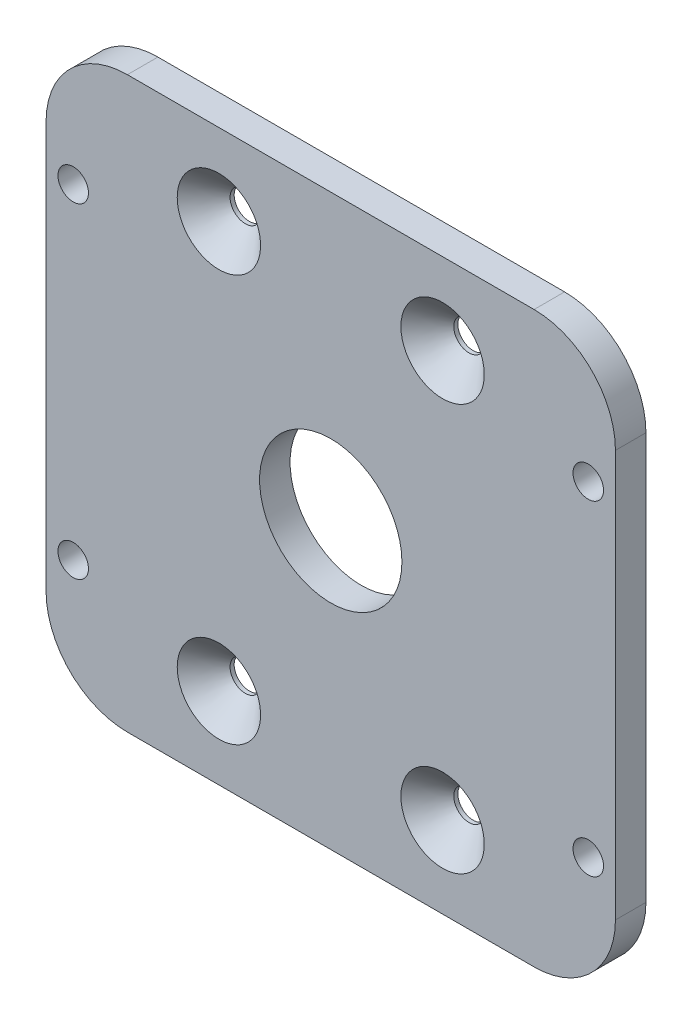
ISO-10303-21;
HEADER;
FILE_DESCRIPTION(('STEP AP214'),'2;1');
FILE_NAME('part.step','',(''),(''),'','','');
FILE_SCHEMA(('AUTOMOTIVE_DESIGN { 1 0 10303 214 1 1 1 1 }'));
ENDSEC;
DATA;
#1=APPLICATION_CONTEXT('core data for automotive mechanical design processes');
#2=APPLICATION_PROTOCOL_DEFINITION('international standard','automotive_design',2000,#1);
#3=PRODUCT_CONTEXT('',#1,'mechanical');
#4=PRODUCT('Part','Part','',(#3));
#5=PRODUCT_RELATED_PRODUCT_CATEGORY('part','',(#4));
#6=PRODUCT_DEFINITION_FORMATION('','',#4);
#7=PRODUCT_DEFINITION_CONTEXT('part definition',#1,'design');
#8=PRODUCT_DEFINITION('design','',#6,#7);
#9=PRODUCT_DEFINITION_SHAPE('','',#8);
#10=(LENGTH_UNIT() NAMED_UNIT(*) SI_UNIT(.MILLI.,.METRE.));
#11=(NAMED_UNIT(*) PLANE_ANGLE_UNIT() SI_UNIT($,.RADIAN.));
#12=(NAMED_UNIT(*) SI_UNIT($,.STERADIAN.) SOLID_ANGLE_UNIT());
#13=UNCERTAINTY_MEASURE_WITH_UNIT(LENGTH_MEASURE(1.E-05),#10,'distance_accuracy_value','');
#14=(GEOMETRIC_REPRESENTATION_CONTEXT(3) GLOBAL_UNCERTAINTY_ASSIGNED_CONTEXT((#13)) GLOBAL_UNIT_ASSIGNED_CONTEXT((#10,
#11,#12)) REPRESENTATION_CONTEXT('',''));
#15=CARTESIAN_POINT('',(0.,0.,0.));
#16=DIRECTION('',(0.,0.,1.));
#17=DIRECTION('',(1.,0.,0.));
#18=AXIS2_PLACEMENT_3D('',#15,#16,#17);
#19=CARTESIAN_POINT('',(48.,48.,3.));
#20=DIRECTION('',(0.,0.,-1.));
#21=DIRECTION('',(-1.,0.,0.));
#22=AXIS2_PLACEMENT_3D('',#19,#20,#21);
#23=CYLINDRICAL_SURFACE('',#22,7.99999999999999);
#24=CARTESIAN_POINT('',(48.,48.,0.));
#25=DIRECTION('',(0.,0.,1.));
#26=DIRECTION('',(-1.,0.,0.));
#27=AXIS2_PLACEMENT_3D('',#24,#25,#26);
#28=CIRCLE('',#27,7.99999999999999);
#29=CARTESIAN_POINT('',(56.,48.,0.));
#30=VERTEX_POINT('',#29);
#31=CARTESIAN_POINT('',(48.,56.,0.));
#32=VERTEX_POINT('',#31);
#33=EDGE_CURVE('E137',#30,#32,#28,.T.);
#34=ORIENTED_EDGE('',*,*,#33,.T.);
#35=DIRECTION('',(0.,0.,-1.));
#36=VECTOR('',#35,1.);
#37=CARTESIAN_POINT('',(48.,56.,3.));
#38=LINE('',#37,#36);
#39=CARTESIAN_POINT('',(48.,56.,3.));
#40=VERTEX_POINT('',#39);
#41=EDGE_CURVE('E165',#40,#32,#38,.T.);
#42=ORIENTED_EDGE('',*,*,#41,.F.);
#43=CARTESIAN_POINT('',(48.,48.,3.));
#44=DIRECTION('',(0.,0.,1.));
#45=DIRECTION('',(-1.,0.,0.));
#46=AXIS2_PLACEMENT_3D('',#43,#44,#45);
#47=CIRCLE('',#46,7.99999999999999);
#48=CARTESIAN_POINT('',(56.,48.,3.));
#49=VERTEX_POINT('',#48);
#50=EDGE_CURVE('E152',#49,#40,#47,.T.);
#51=ORIENTED_EDGE('',*,*,#50,.F.);
#52=DIRECTION('',(0.,0.,-1.));
#53=VECTOR('',#52,1.);
#54=CARTESIAN_POINT('',(56.,48.,3.));
#55=LINE('',#54,#53);
#56=EDGE_CURVE('E133',#49,#30,#55,.T.);
#57=ORIENTED_EDGE('',*,*,#56,.T.);
#58=EDGE_LOOP('',(#34,#42,#51,#57));
#59=FACE_BOUND('',#58,.T.);
#60=ADVANCED_FACE('F38',(#59),#23,.T.);
#61=CARTESIAN_POINT('',(8.,56.,3.));
#62=DIRECTION('',(0.,-1.,0.));
#63=DIRECTION('',(1.,0.,0.));
#64=AXIS2_PLACEMENT_3D('',#61,#62,#63);
#65=PLANE('',#64);
#66=DIRECTION('',(-1.,0.,0.));
#67=VECTOR('',#66,1.);
#68=CARTESIAN_POINT('',(8.,56.,0.));
#69=LINE('',#68,#67);
#70=CARTESIAN_POINT('',(8.,56.,0.));
#71=VERTEX_POINT('',#70);
#72=EDGE_CURVE('E140',#32,#71,#69,.T.);
#73=ORIENTED_EDGE('',*,*,#72,.T.);
#74=DIRECTION('',(0.,0.,-1.));
#75=VECTOR('',#74,1.);
#76=CARTESIAN_POINT('',(8.,56.,3.));
#77=LINE('',#76,#75);
#78=CARTESIAN_POINT('',(8.,56.,3.));
#79=VERTEX_POINT('',#78);
#80=EDGE_CURVE('E162',#79,#71,#77,.T.);
#81=ORIENTED_EDGE('',*,*,#80,.F.);
#82=DIRECTION('',(-1.,0.,0.));
#83=VECTOR('',#82,1.);
#84=CARTESIAN_POINT('',(8.,56.,3.));
#85=LINE('',#84,#83);
#86=EDGE_CURVE('E100',#40,#79,#85,.T.);
#87=ORIENTED_EDGE('',*,*,#86,.F.);
#88=ORIENTED_EDGE('',*,*,#41,.T.);
#89=EDGE_LOOP('',(#73,#81,#87,#88));
#90=FACE_BOUND('',#89,.T.);
#91=ADVANCED_FACE('F205',(#90),#65,.F.);
#92=CARTESIAN_POINT('',(8.,48.,3.));
#93=DIRECTION('',(0.,0.,-1.));
#94=DIRECTION('',(-1.,0.,0.));
#95=AXIS2_PLACEMENT_3D('',#92,#93,#94);
#96=CYLINDRICAL_SURFACE('',#95,8.);
#97=CARTESIAN_POINT('',(8.,48.,0.));
#98=DIRECTION('',(0.,0.,1.));
#99=DIRECTION('',(-1.,0.,0.));
#100=AXIS2_PLACEMENT_3D('',#97,#98,#99);
#101=CIRCLE('',#100,8.);
#102=CARTESIAN_POINT('',(0.,48.,0.));
#103=VERTEX_POINT('',#102);
#104=EDGE_CURVE('E143',#71,#103,#101,.T.);
#105=ORIENTED_EDGE('',*,*,#104,.T.);
#106=DIRECTION('',(0.,0.,-1.));
#107=VECTOR('',#106,1.);
#108=CARTESIAN_POINT('',(0.,48.,3.));
#109=LINE('',#108,#107);
#110=CARTESIAN_POINT('',(0.,48.,3.));
#111=VERTEX_POINT('',#110);
#112=EDGE_CURVE('E159',#111,#103,#109,.T.);
#113=ORIENTED_EDGE('',*,*,#112,.F.);
#114=CARTESIAN_POINT('',(8.,48.,3.));
#115=DIRECTION('',(0.,0.,1.));
#116=DIRECTION('',(-1.,0.,0.));
#117=AXIS2_PLACEMENT_3D('',#114,#115,#116);
#118=CIRCLE('',#117,8.);
#119=EDGE_CURVE('E288',#79,#111,#118,.T.);
#120=ORIENTED_EDGE('',*,*,#119,.F.);
#121=ORIENTED_EDGE('',*,*,#80,.T.);
#122=EDGE_LOOP('',(#105,#113,#120,#121));
#123=FACE_BOUND('',#122,.T.);
#124=ADVANCED_FACE('F211',(#123),#96,.T.);
#125=CARTESIAN_POINT('',(0.,8.,3.));
#126=DIRECTION('',(1.,0.,0.));
#127=DIRECTION('',(0.,1.,0.));
#128=AXIS2_PLACEMENT_3D('',#125,#126,#127);
#129=PLANE('',#128);
#130=DIRECTION('',(0.,-1.,0.));
#131=VECTOR('',#130,1.);
#132=CARTESIAN_POINT('',(0.,8.,0.));
#133=LINE('',#132,#131);
#134=CARTESIAN_POINT('',(0.,8.,0.));
#135=VERTEX_POINT('',#134);
#136=EDGE_CURVE('E145',#103,#135,#133,.T.);
#137=ORIENTED_EDGE('',*,*,#136,.T.);
#138=DIRECTION('',(0.,0.,-1.));
#139=VECTOR('',#138,1.);
#140=CARTESIAN_POINT('',(0.,8.,3.));
#141=LINE('',#140,#139);
#142=CARTESIAN_POINT('',(0.,8.,3.));
#143=VERTEX_POINT('',#142);
#144=EDGE_CURVE('E156',#143,#135,#141,.T.);
#145=ORIENTED_EDGE('',*,*,#144,.F.);
#146=DIRECTION('',(0.,-1.,0.));
#147=VECTOR('',#146,1.);
#148=CARTESIAN_POINT('',(0.,8.,3.));
#149=LINE('',#148,#147);
#150=EDGE_CURVE('E290',#111,#143,#149,.T.);
#151=ORIENTED_EDGE('',*,*,#150,.F.);
#152=ORIENTED_EDGE('',*,*,#112,.T.);
#153=EDGE_LOOP('',(#137,#145,#151,#152));
#154=FACE_BOUND('',#153,.T.);
#155=ADVANCED_FACE('F296',(#154),#129,.F.);
#156=CARTESIAN_POINT('',(8.,8.,3.));
#157=DIRECTION('',(0.,0.,-1.));
#158=DIRECTION('',(-1.,0.,0.));
#159=AXIS2_PLACEMENT_3D('',#156,#157,#158);
#160=CYLINDRICAL_SURFACE('',#159,8.);
#161=CARTESIAN_POINT('',(8.,8.,0.));
#162=DIRECTION('',(0.,0.,1.));
#163=DIRECTION('',(-1.,0.,0.));
#164=AXIS2_PLACEMENT_3D('',#161,#162,#163);
#165=CIRCLE('',#164,8.);
#166=CARTESIAN_POINT('',(8.,0.,0.));
#167=VERTEX_POINT('',#166);
#168=EDGE_CURVE('E147',#135,#167,#165,.T.);
#169=ORIENTED_EDGE('',*,*,#168,.T.);
#170=DIRECTION('',(0.,0.,-1.));
#171=VECTOR('',#170,1.);
#172=CARTESIAN_POINT('',(8.,0.,3.));
#173=LINE('',#172,#171);
#174=CARTESIAN_POINT('',(8.,0.,3.));
#175=VERTEX_POINT('',#174);
#176=EDGE_CURVE('E128',#175,#167,#173,.T.);
#177=ORIENTED_EDGE('',*,*,#176,.F.);
#178=CARTESIAN_POINT('',(8.,8.,3.));
#179=DIRECTION('',(0.,0.,1.));
#180=DIRECTION('',(-1.,0.,0.));
#181=AXIS2_PLACEMENT_3D('',#178,#179,#180);
#182=CIRCLE('',#181,8.);
#183=EDGE_CURVE('E119',#143,#175,#182,.T.);
#184=ORIENTED_EDGE('',*,*,#183,.F.);
#185=ORIENTED_EDGE('',*,*,#144,.T.);
#186=EDGE_LOOP('',(#169,#177,#184,#185));
#187=FACE_BOUND('',#186,.T.);
#188=ADVANCED_FACE('F300',(#187),#160,.T.);
#189=CARTESIAN_POINT('',(8.,0.,3.));
#190=DIRECTION('',(0.,1.,0.));
#191=DIRECTION('',(0.,0.,1.));
#192=AXIS2_PLACEMENT_3D('',#189,#190,#191);
#193=PLANE('',#192);
#194=DIRECTION('',(1.,0.,0.));
#195=VECTOR('',#194,1.);
#196=CARTESIAN_POINT('',(8.,0.,0.));
#197=LINE('',#196,#195);
#198=CARTESIAN_POINT('',(48.,0.,0.));
#199=VERTEX_POINT('',#198);
#200=EDGE_CURVE('E127',#167,#199,#197,.T.);
#201=ORIENTED_EDGE('',*,*,#200,.T.);
#202=DIRECTION('',(0.,0.,-1.));
#203=VECTOR('',#202,1.);
#204=CARTESIAN_POINT('',(48.,0.,3.));
#205=LINE('',#204,#203);
#206=CARTESIAN_POINT('',(48.,0.,3.));
#207=VERTEX_POINT('',#206);
#208=EDGE_CURVE('E124',#207,#199,#205,.T.);
#209=ORIENTED_EDGE('',*,*,#208,.F.);
#210=DIRECTION('',(1.,0.,0.));
#211=VECTOR('',#210,1.);
#212=CARTESIAN_POINT('',(8.,0.,3.));
#213=LINE('',#212,#211);
#214=EDGE_CURVE('E113',#175,#207,#213,.T.);
#215=ORIENTED_EDGE('',*,*,#214,.F.);
#216=ORIENTED_EDGE('',*,*,#176,.T.);
#217=EDGE_LOOP('',(#201,#209,#215,#216));
#218=FACE_BOUND('',#217,.T.);
#219=ADVANCED_FACE('F125',(#218),#193,.F.);
#220=CARTESIAN_POINT('',(48.,8.,3.));
#221=DIRECTION('',(0.,0.,-1.));
#222=DIRECTION('',(-1.,0.,0.));
#223=AXIS2_PLACEMENT_3D('',#220,#221,#222);
#224=CYLINDRICAL_SURFACE('',#223,8.);
#225=CARTESIAN_POINT('',(48.,8.,0.));
#226=DIRECTION('',(0.,0.,1.));
#227=DIRECTION('',(1.,0.,0.));
#228=AXIS2_PLACEMENT_3D('',#225,#226,#227);
#229=CIRCLE('',#228,8.);
#230=CARTESIAN_POINT('',(56.,8.,0.));
#231=VERTEX_POINT('',#230);
#232=EDGE_CURVE('E85',#199,#231,#229,.T.);
#233=ORIENTED_EDGE('',*,*,#232,.T.);
#234=DIRECTION('',(0.,0.,-1.));
#235=VECTOR('',#234,1.);
#236=CARTESIAN_POINT('',(56.,8.,3.));
#237=LINE('',#236,#235);
#238=CARTESIAN_POINT('',(56.,8.,3.));
#239=VERTEX_POINT('',#238);
#240=EDGE_CURVE('E129',#239,#231,#237,.T.);
#241=ORIENTED_EDGE('',*,*,#240,.F.);
#242=CARTESIAN_POINT('',(48.,8.,3.));
#243=DIRECTION('',(0.,0.,1.));
#244=DIRECTION('',(1.,0.,0.));
#245=AXIS2_PLACEMENT_3D('',#242,#243,#244);
#246=CIRCLE('',#245,8.);
#247=EDGE_CURVE('E117',#207,#239,#246,.T.);
#248=ORIENTED_EDGE('',*,*,#247,.F.);
#249=ORIENTED_EDGE('',*,*,#208,.T.);
#250=EDGE_LOOP('',(#233,#241,#248,#249));
#251=FACE_BOUND('',#250,.T.);
#252=ADVANCED_FACE('F131',(#251),#224,.T.);
#253=CARTESIAN_POINT('',(56.,8.,3.));
#254=DIRECTION('',(-1.,0.,0.));
#255=DIRECTION('',(0.,-1.,0.));
#256=AXIS2_PLACEMENT_3D('',#253,#254,#255);
#257=PLANE('',#256);
#258=DIRECTION('',(0.,1.,0.));
#259=VECTOR('',#258,1.);
#260=CARTESIAN_POINT('',(56.,8.,0.));
#261=LINE('',#260,#259);
#262=EDGE_CURVE('E91',#231,#30,#261,.T.);
#263=ORIENTED_EDGE('',*,*,#262,.T.);
#264=ORIENTED_EDGE('',*,*,#56,.F.);
#265=DIRECTION('',(0.,1.,0.));
#266=VECTOR('',#265,1.);
#267=CARTESIAN_POINT('',(56.,8.,3.));
#268=LINE('',#267,#266);
#269=EDGE_CURVE('E56',#239,#49,#268,.T.);
#270=ORIENTED_EDGE('',*,*,#269,.F.);
#271=ORIENTED_EDGE('',*,*,#240,.T.);
#272=EDGE_LOOP('',(#263,#264,#270,#271));
#273=FACE_BOUND('',#272,.T.);
#274=ADVANCED_FACE('F307',(#273),#257,.F.);
#275=CARTESIAN_POINT('',(48.,48.,3.));
#276=DIRECTION('',(0.,0.,-1.));
#277=DIRECTION('',(-1.,0.,0.));
#278=AXIS2_PLACEMENT_3D('',#275,#276,#277);
#279=PLANE('',#278);
#280=CARTESIAN_POINT('',(39.,8.,3.));
#281=DIRECTION('',(0.,0.,-1.));
#282=DIRECTION('',(-1.,0.,0.));
#283=AXIS2_PLACEMENT_3D('',#280,#281,#282);
#284=CIRCLE('',#283,4.1);
#285=CARTESIAN_POINT('',(34.9,8.,3.));
#286=VERTEX_POINT('',#285);
#287=EDGE_CURVE('E179',#286,#286,#284,.T.);
#288=ORIENTED_EDGE('',*,*,#287,.T.);
#289=EDGE_LOOP('',(#288));
#290=FACE_BOUND('',#289,.T.);
#291=CARTESIAN_POINT('',(17.,8.,3.));
#292=DIRECTION('',(0.,0.,-1.));
#293=DIRECTION('',(-1.,0.,0.));
#294=AXIS2_PLACEMENT_3D('',#291,#292,#293);
#295=CIRCLE('',#294,4.10000000000002);
#296=CARTESIAN_POINT('',(12.9,8.,3.));
#297=VERTEX_POINT('',#296);
#298=EDGE_CURVE('E176',#297,#297,#295,.T.);
#299=ORIENTED_EDGE('',*,*,#298,.T.);
#300=EDGE_LOOP('',(#299));
#301=FACE_BOUND('',#300,.T.);
#302=CARTESIAN_POINT('',(38.9999999999999,48.,3.));
#303=DIRECTION('',(0.,0.,-1.));
#304=DIRECTION('',(-1.,0.,0.));
#305=AXIS2_PLACEMENT_3D('',#302,#303,#304);
#306=CIRCLE('',#305,4.10000000000001);
#307=CARTESIAN_POINT('',(34.8999999999999,48.,3.));
#308=VERTEX_POINT('',#307);
#309=EDGE_CURVE('E173',#308,#308,#306,.T.);
#310=ORIENTED_EDGE('',*,*,#309,.T.);
#311=EDGE_LOOP('',(#310));
#312=FACE_BOUND('',#311,.T.);
#313=CARTESIAN_POINT('',(16.9999999999999,48.,3.));
#314=DIRECTION('',(0.,0.,-1.));
#315=DIRECTION('',(-1.,0.,0.));
#316=AXIS2_PLACEMENT_3D('',#313,#314,#315);
#317=CIRCLE('',#316,4.10000000000002);
#318=CARTESIAN_POINT('',(12.8999999999998,48.,3.));
#319=VERTEX_POINT('',#318);
#320=EDGE_CURVE('E170',#319,#319,#317,.T.);
#321=ORIENTED_EDGE('',*,*,#320,.T.);
#322=EDGE_LOOP('',(#321));
#323=FACE_BOUND('',#322,.T.);
#324=CARTESIAN_POINT('',(2.6699999999999,44.,3.));
#325=DIRECTION('',(0.,0.,1.));
#326=DIRECTION('',(1.,0.,0.));
#327=AXIS2_PLACEMENT_3D('',#324,#325,#326);
#328=CIRCLE('',#327,1.5);
#329=CARTESIAN_POINT('',(4.1699999999999,44.,3.));
#330=VERTEX_POINT('',#329);
#331=EDGE_CURVE('E250',#330,#330,#328,.T.);
#332=ORIENTED_EDGE('',*,*,#331,.F.);
#333=EDGE_LOOP('',(#332));
#334=FACE_BOUND('',#333,.T.);
#335=CARTESIAN_POINT('',(53.3299999999999,44.,3.));
#336=DIRECTION('',(0.,0.,1.));
#337=DIRECTION('',(1.,0.,0.));
#338=AXIS2_PLACEMENT_3D('',#335,#336,#337);
#339=CIRCLE('',#338,1.5);
#340=CARTESIAN_POINT('',(54.8299999999999,44.,3.));
#341=VERTEX_POINT('',#340);
#342=EDGE_CURVE('E268',#341,#341,#339,.T.);
#343=ORIENTED_EDGE('',*,*,#342,.F.);
#344=EDGE_LOOP('',(#343));
#345=FACE_BOUND('',#344,.T.);
#346=CARTESIAN_POINT('',(53.33,12.,3.));
#347=DIRECTION('',(0.,0.,1.));
#348=DIRECTION('',(1.,0.,0.));
#349=AXIS2_PLACEMENT_3D('',#346,#347,#348);
#350=CIRCLE('',#349,1.5);
#351=CARTESIAN_POINT('',(54.83,12.,3.));
#352=VERTEX_POINT('',#351);
#353=EDGE_CURVE('E262',#352,#352,#350,.T.);
#354=ORIENTED_EDGE('',*,*,#353,.F.);
#355=EDGE_LOOP('',(#354));
#356=FACE_BOUND('',#355,.T.);
#357=CARTESIAN_POINT('',(2.67000000000001,12.,3.));
#358=DIRECTION('',(0.,0.,1.));
#359=DIRECTION('',(1.,0.,0.));
#360=AXIS2_PLACEMENT_3D('',#357,#358,#359);
#361=CIRCLE('',#360,1.5);
#362=CARTESIAN_POINT('',(4.17000000000001,12.,3.));
#363=VERTEX_POINT('',#362);
#364=EDGE_CURVE('E261',#363,#363,#361,.T.);
#365=ORIENTED_EDGE('',*,*,#364,.F.);
#366=EDGE_LOOP('',(#365));
#367=FACE_BOUND('',#366,.T.);
#368=CARTESIAN_POINT('',(28.,28.,3.));
#369=DIRECTION('',(0.,0.,1.));
#370=DIRECTION('',(1.,0.,0.));
#371=AXIS2_PLACEMENT_3D('',#368,#369,#370);
#372=CIRCLE('',#371,7.);
#373=CARTESIAN_POINT('',(35.,28.,3.));
#374=VERTEX_POINT('',#373);
#375=EDGE_CURVE('E279',#374,#374,#372,.T.);
#376=ORIENTED_EDGE('',*,*,#375,.F.);
#377=EDGE_LOOP('',(#376));
#378=FACE_BOUND('',#377,.T.);
#379=ORIENTED_EDGE('',*,*,#50,.T.);
#380=ORIENTED_EDGE('',*,*,#86,.T.);
#381=ORIENTED_EDGE('',*,*,#119,.T.);
#382=ORIENTED_EDGE('',*,*,#150,.T.);
#383=ORIENTED_EDGE('',*,*,#183,.T.);
#384=ORIENTED_EDGE('',*,*,#214,.T.);
#385=ORIENTED_EDGE('',*,*,#247,.T.);
#386=ORIENTED_EDGE('',*,*,#269,.T.);
#387=EDGE_LOOP('',(#379,#380,#381,#382,#383,#384,#385,#386));
#388=FACE_BOUND('',#387,.T.);
#389=ADVANCED_FACE('F115',(#290,#301,#312,#323,#334,#345,#356,#367,#378,#388),#279,.F.);
#390=CARTESIAN_POINT('',(48.,48.,0.));
#391=DIRECTION('',(0.,0.,-1.));
#392=DIRECTION('',(-1.,0.,0.));
#393=AXIS2_PLACEMENT_3D('',#390,#391,#392);
#394=PLANE('',#393);
#395=CARTESIAN_POINT('',(16.9999999999999,48.,0.));
#396=DIRECTION('',(0.,0.,1.));
#397=DIRECTION('',(1.,0.,0.));
#398=AXIS2_PLACEMENT_3D('',#395,#396,#397);
#399=CIRCLE('',#398,1.5);
#400=CARTESIAN_POINT('',(18.4999999999999,48.,0.));
#401=VERTEX_POINT('',#400);
#402=EDGE_CURVE('E253',#401,#401,#399,.T.);
#403=ORIENTED_EDGE('',*,*,#402,.T.);
#404=EDGE_LOOP('',(#403));
#405=FACE_BOUND('',#404,.T.);
#406=CARTESIAN_POINT('',(38.9999999999999,48.,0.));
#407=DIRECTION('',(0.,0.,1.));
#408=DIRECTION('',(1.,0.,0.));
#409=AXIS2_PLACEMENT_3D('',#406,#407,#408);
#410=CIRCLE('',#409,1.5);
#411=CARTESIAN_POINT('',(40.4999999999999,48.,0.));
#412=VERTEX_POINT('',#411);
#413=EDGE_CURVE('E247',#412,#412,#410,.T.);
#414=ORIENTED_EDGE('',*,*,#413,.T.);
#415=EDGE_LOOP('',(#414));
#416=FACE_BOUND('',#415,.T.);
#417=CARTESIAN_POINT('',(39.,8.,0.));
#418=DIRECTION('',(0.,0.,1.));
#419=DIRECTION('',(1.,0.,0.));
#420=AXIS2_PLACEMENT_3D('',#417,#418,#419);
#421=CIRCLE('',#420,1.5);
#422=CARTESIAN_POINT('',(40.5,8.,0.));
#423=VERTEX_POINT('',#422);
#424=EDGE_CURVE('E244',#423,#423,#421,.T.);
#425=ORIENTED_EDGE('',*,*,#424,.T.);
#426=EDGE_LOOP('',(#425));
#427=FACE_BOUND('',#426,.T.);
#428=CARTESIAN_POINT('',(17.,8.,0.));
#429=DIRECTION('',(0.,0.,1.));
#430=DIRECTION('',(1.,0.,0.));
#431=AXIS2_PLACEMENT_3D('',#428,#429,#430);
#432=CIRCLE('',#431,1.5);
#433=CARTESIAN_POINT('',(18.5,8.,0.));
#434=VERTEX_POINT('',#433);
#435=EDGE_CURVE('E246',#434,#434,#432,.T.);
#436=ORIENTED_EDGE('',*,*,#435,.T.);
#437=EDGE_LOOP('',(#436));
#438=FACE_BOUND('',#437,.T.);
#439=CARTESIAN_POINT('',(2.6699999999999,44.,0.));
#440=DIRECTION('',(0.,0.,1.));
#441=DIRECTION('',(1.,0.,0.));
#442=AXIS2_PLACEMENT_3D('',#439,#440,#441);
#443=CIRCLE('',#442,1.5);
#444=CARTESIAN_POINT('',(4.1699999999999,44.,0.));
#445=VERTEX_POINT('',#444);
#446=EDGE_CURVE('E271',#445,#445,#443,.T.);
#447=ORIENTED_EDGE('',*,*,#446,.T.);
#448=EDGE_LOOP('',(#447));
#449=FACE_BOUND('',#448,.T.);
#450=CARTESIAN_POINT('',(53.3299999999999,44.,0.));
#451=DIRECTION('',(0.,0.,1.));
#452=DIRECTION('',(1.,0.,0.));
#453=AXIS2_PLACEMENT_3D('',#450,#451,#452);
#454=CIRCLE('',#453,1.5);
#455=CARTESIAN_POINT('',(54.8299999999999,44.,0.));
#456=VERTEX_POINT('',#455);
#457=EDGE_CURVE('E265',#456,#456,#454,.T.);
#458=ORIENTED_EDGE('',*,*,#457,.T.);
#459=EDGE_LOOP('',(#458));
#460=FACE_BOUND('',#459,.T.);
#461=CARTESIAN_POINT('',(53.33,12.,0.));
#462=DIRECTION('',(0.,0.,1.));
#463=DIRECTION('',(1.,0.,0.));
#464=AXIS2_PLACEMENT_3D('',#461,#462,#463);
#465=CIRCLE('',#464,1.5);
#466=CARTESIAN_POINT('',(54.83,12.,0.));
#467=VERTEX_POINT('',#466);
#468=EDGE_CURVE('E258',#467,#467,#465,.T.);
#469=ORIENTED_EDGE('',*,*,#468,.T.);
#470=EDGE_LOOP('',(#469));
#471=FACE_BOUND('',#470,.T.);
#472=CARTESIAN_POINT('',(2.67000000000001,12.,0.));
#473=DIRECTION('',(0.,0.,1.));
#474=DIRECTION('',(1.,0.,0.));
#475=AXIS2_PLACEMENT_3D('',#472,#473,#474);
#476=CIRCLE('',#475,1.5);
#477=CARTESIAN_POINT('',(4.17000000000001,12.,0.));
#478=VERTEX_POINT('',#477);
#479=EDGE_CURVE('E276',#478,#478,#476,.T.);
#480=ORIENTED_EDGE('',*,*,#479,.T.);
#481=EDGE_LOOP('',(#480));
#482=FACE_BOUND('',#481,.T.);
#483=CARTESIAN_POINT('',(28.,28.,0.));
#484=DIRECTION('',(0.,0.,1.));
#485=DIRECTION('',(1.,0.,0.));
#486=AXIS2_PLACEMENT_3D('',#483,#484,#485);
#487=CIRCLE('',#486,7.);
#488=CARTESIAN_POINT('',(35.,28.,0.));
#489=VERTEX_POINT('',#488);
#490=EDGE_CURVE('E141',#489,#489,#487,.T.);
#491=ORIENTED_EDGE('',*,*,#490,.T.);
#492=EDGE_LOOP('',(#491));
#493=FACE_BOUND('',#492,.T.);
#494=ORIENTED_EDGE('',*,*,#33,.F.);
#495=ORIENTED_EDGE('',*,*,#262,.F.);
#496=ORIENTED_EDGE('',*,*,#232,.F.);
#497=ORIENTED_EDGE('',*,*,#200,.F.);
#498=ORIENTED_EDGE('',*,*,#168,.F.);
#499=ORIENTED_EDGE('',*,*,#136,.F.);
#500=ORIENTED_EDGE('',*,*,#104,.F.);
#501=ORIENTED_EDGE('',*,*,#72,.F.);
#502=EDGE_LOOP('',(#494,#495,#496,#497,#498,#499,#500,#501));
#503=FACE_BOUND('',#502,.T.);
#504=ADVANCED_FACE('F303',(#405,#416,#427,#438,#449,#460,#471,#482,#493,#503),#394,.T.);
#505=CARTESIAN_POINT('',(28.,28.,0.));
#506=DIRECTION('',(0.,0.,1.));
#507=DIRECTION('',(1.,0.,0.));
#508=AXIS2_PLACEMENT_3D('',#505,#506,#507);
#509=CYLINDRICAL_SURFACE('',#508,7.);
#510=ORIENTED_EDGE('',*,*,#490,.F.);
#511=EDGE_LOOP('',(#510));
#512=FACE_BOUND('',#511,.T.);
#513=ORIENTED_EDGE('',*,*,#375,.T.);
#514=EDGE_LOOP('',(#513));
#515=FACE_BOUND('',#514,.T.);
#516=ADVANCED_FACE('F356',(#512,#515),#509,.F.);
#517=CARTESIAN_POINT('',(2.67000000000001,12.,0.));
#518=DIRECTION('',(0.,0.,1.));
#519=DIRECTION('',(1.,0.,0.));
#520=AXIS2_PLACEMENT_3D('',#517,#518,#519);
#521=CYLINDRICAL_SURFACE('',#520,1.5);
#522=ORIENTED_EDGE('',*,*,#479,.F.);
#523=EDGE_LOOP('',(#522));
#524=FACE_BOUND('',#523,.T.);
#525=ORIENTED_EDGE('',*,*,#364,.T.);
#526=EDGE_LOOP('',(#525));
#527=FACE_BOUND('',#526,.T.);
#528=ADVANCED_FACE('F361',(#524,#527),#521,.F.);
#529=CARTESIAN_POINT('',(53.33,12.,0.));
#530=DIRECTION('',(0.,0.,1.));
#531=DIRECTION('',(1.,0.,0.));
#532=AXIS2_PLACEMENT_3D('',#529,#530,#531);
#533=CYLINDRICAL_SURFACE('',#532,1.5);
#534=ORIENTED_EDGE('',*,*,#468,.F.);
#535=EDGE_LOOP('',(#534));
#536=FACE_BOUND('',#535,.T.);
#537=ORIENTED_EDGE('',*,*,#353,.T.);
#538=EDGE_LOOP('',(#537));
#539=FACE_BOUND('',#538,.T.);
#540=ADVANCED_FACE('F373',(#536,#539),#533,.F.);
#541=CARTESIAN_POINT('',(53.3299999999999,44.,0.));
#542=DIRECTION('',(0.,0.,1.));
#543=DIRECTION('',(1.,0.,0.));
#544=AXIS2_PLACEMENT_3D('',#541,#542,#543);
#545=CYLINDRICAL_SURFACE('',#544,1.5);
#546=ORIENTED_EDGE('',*,*,#457,.F.);
#547=EDGE_LOOP('',(#546));
#548=FACE_BOUND('',#547,.T.);
#549=ORIENTED_EDGE('',*,*,#342,.T.);
#550=EDGE_LOOP('',(#549));
#551=FACE_BOUND('',#550,.T.);
#552=ADVANCED_FACE('F383',(#548,#551),#545,.F.);
#553=CARTESIAN_POINT('',(2.6699999999999,44.,0.));
#554=DIRECTION('',(0.,0.,1.));
#555=DIRECTION('',(1.,0.,0.));
#556=AXIS2_PLACEMENT_3D('',#553,#554,#555);
#557=CYLINDRICAL_SURFACE('',#556,1.5);
#558=ORIENTED_EDGE('',*,*,#446,.F.);
#559=EDGE_LOOP('',(#558));
#560=FACE_BOUND('',#559,.T.);
#561=ORIENTED_EDGE('',*,*,#331,.T.);
#562=EDGE_LOOP('',(#561));
#563=FACE_BOUND('',#562,.T.);
#564=ADVANCED_FACE('F393',(#560,#563),#557,.F.);
#565=CARTESIAN_POINT('',(17.,8.,0.));
#566=DIRECTION('',(0.,0.,1.));
#567=DIRECTION('',(1.,0.,0.));
#568=AXIS2_PLACEMENT_3D('',#565,#566,#567);
#569=CYLINDRICAL_SURFACE('',#568,1.5);
#570=CARTESIAN_POINT('',(17.,8.,0.399999999999989));
#571=DIRECTION('',(0.,0.,-1.));
#572=DIRECTION('',(-1.,0.,0.));
#573=AXIS2_PLACEMENT_3D('',#570,#571,#572);
#574=CIRCLE('',#573,1.5);
#575=CARTESIAN_POINT('',(15.5,8.,0.399999999999989));
#576=VERTEX_POINT('',#575);
#577=EDGE_CURVE('E182',#576,#576,#574,.F.);
#578=ORIENTED_EDGE('',*,*,#577,.T.);
#579=EDGE_LOOP('',(#578));
#580=FACE_BOUND('',#579,.T.);
#581=ORIENTED_EDGE('',*,*,#435,.F.);
#582=EDGE_LOOP('',(#581));
#583=FACE_BOUND('',#582,.T.);
#584=ADVANCED_FACE('F240',(#580,#583),#569,.F.);
#585=CARTESIAN_POINT('',(39.,8.,0.));
#586=DIRECTION('',(0.,0.,1.));
#587=DIRECTION('',(1.,0.,0.));
#588=AXIS2_PLACEMENT_3D('',#585,#586,#587);
#589=CYLINDRICAL_SURFACE('',#588,1.5);
#590=CARTESIAN_POINT('',(39.,8.,0.400000000000006));
#591=DIRECTION('',(0.,0.,-1.));
#592=DIRECTION('',(-1.,0.,0.));
#593=AXIS2_PLACEMENT_3D('',#590,#591,#592);
#594=CIRCLE('',#593,1.5);
#595=CARTESIAN_POINT('',(37.5,8.,0.400000000000006));
#596=VERTEX_POINT('',#595);
#597=EDGE_CURVE('E167',#596,#596,#594,.F.);
#598=ORIENTED_EDGE('',*,*,#597,.T.);
#599=EDGE_LOOP('',(#598));
#600=FACE_BOUND('',#599,.T.);
#601=ORIENTED_EDGE('',*,*,#424,.F.);
#602=EDGE_LOOP('',(#601));
#603=FACE_BOUND('',#602,.T.);
#604=ADVANCED_FACE('F237',(#600,#603),#589,.F.);
#605=CARTESIAN_POINT('',(38.9999999999999,48.,0.));
#606=DIRECTION('',(0.,0.,1.));
#607=DIRECTION('',(1.,0.,0.));
#608=AXIS2_PLACEMENT_3D('',#605,#606,#607);
#609=CYLINDRICAL_SURFACE('',#608,1.5);
#610=CARTESIAN_POINT('',(38.9999999999999,48.,0.400000000000006));
#611=DIRECTION('',(0.,0.,-1.));
#612=DIRECTION('',(-1.,0.,0.));
#613=AXIS2_PLACEMENT_3D('',#610,#611,#612);
#614=CIRCLE('',#613,1.5);
#615=CARTESIAN_POINT('',(37.4999999999999,48.,0.400000000000006));
#616=VERTEX_POINT('',#615);
#617=EDGE_CURVE('E48',#616,#616,#614,.F.);
#618=ORIENTED_EDGE('',*,*,#617,.T.);
#619=EDGE_LOOP('',(#618));
#620=FACE_BOUND('',#619,.T.);
#621=ORIENTED_EDGE('',*,*,#413,.F.);
#622=EDGE_LOOP('',(#621));
#623=FACE_BOUND('',#622,.T.);
#624=ADVANCED_FACE('F187',(#620,#623),#609,.F.);
#625=CARTESIAN_POINT('',(16.9999999999999,48.,0.));
#626=DIRECTION('',(0.,0.,1.));
#627=DIRECTION('',(1.,0.,0.));
#628=AXIS2_PLACEMENT_3D('',#625,#626,#627);
#629=CYLINDRICAL_SURFACE('',#628,1.5);
#630=CARTESIAN_POINT('',(16.9999999999999,48.,0.399999999999989));
#631=DIRECTION('',(0.,0.,-1.));
#632=DIRECTION('',(-1.,0.,0.));
#633=AXIS2_PLACEMENT_3D('',#630,#631,#632);
#634=CIRCLE('',#633,1.5);
#635=CARTESIAN_POINT('',(15.4999999999999,48.,0.399999999999989));
#636=VERTEX_POINT('',#635);
#637=EDGE_CURVE('E11',#636,#636,#634,.F.);
#638=ORIENTED_EDGE('',*,*,#637,.T.);
#639=EDGE_LOOP('',(#638));
#640=FACE_BOUND('',#639,.T.);
#641=ORIENTED_EDGE('',*,*,#402,.F.);
#642=EDGE_LOOP('',(#641));
#643=FACE_BOUND('',#642,.T.);
#644=ADVANCED_FACE('F220',(#640,#643),#629,.F.);
#645=CARTESIAN_POINT('',(39.,8.,0.400000000000006));
#646=DIRECTION('',(0.,0.,1.));
#647=DIRECTION('',(1.,0.,0.));
#648=AXIS2_PLACEMENT_3D('',#645,#646,#647);
#649=CONICAL_SURFACE('',#648,1.5,0.78539816339745);
#650=ORIENTED_EDGE('',*,*,#287,.F.);
#651=EDGE_LOOP('',(#650));
#652=FACE_BOUND('',#651,.T.);
#653=ORIENTED_EDGE('',*,*,#597,.F.);
#654=EDGE_LOOP('',(#653));
#655=FACE_BOUND('',#654,.T.);
#656=ADVANCED_FACE('F199',(#652,#655),#649,.F.);
#657=CARTESIAN_POINT('',(17.,8.,0.399999999999989));
#658=DIRECTION('',(0.,0.,1.));
#659=DIRECTION('',(1.,0.,0.));
#660=AXIS2_PLACEMENT_3D('',#657,#658,#659);
#661=CONICAL_SURFACE('',#660,1.5,0.78539816339745);
#662=ORIENTED_EDGE('',*,*,#298,.F.);
#663=EDGE_LOOP('',(#662));
#664=FACE_BOUND('',#663,.T.);
#665=ORIENTED_EDGE('',*,*,#577,.F.);
#666=EDGE_LOOP('',(#665));
#667=FACE_BOUND('',#666,.T.);
#668=ADVANCED_FACE('F192',(#664,#667),#661,.F.);
#669=CARTESIAN_POINT('',(38.9999999999999,48.,0.400000000000006));
#670=DIRECTION('',(0.,0.,1.));
#671=DIRECTION('',(1.,0.,0.));
#672=AXIS2_PLACEMENT_3D('',#669,#670,#671);
#673=CONICAL_SURFACE('',#672,1.5,0.785398163397451);
#674=ORIENTED_EDGE('',*,*,#309,.F.);
#675=EDGE_LOOP('',(#674));
#676=FACE_BOUND('',#675,.T.);
#677=ORIENTED_EDGE('',*,*,#617,.F.);
#678=EDGE_LOOP('',(#677));
#679=FACE_BOUND('',#678,.T.);
#680=ADVANCED_FACE('F190',(#676,#679),#673,.F.);
#681=CARTESIAN_POINT('',(16.9999999999999,48.,0.399999999999989));
#682=DIRECTION('',(0.,0.,1.));
#683=DIRECTION('',(1.,0.,0.));
#684=AXIS2_PLACEMENT_3D('',#681,#682,#683);
#685=CONICAL_SURFACE('',#684,1.5,0.78539816339745);
#686=ORIENTED_EDGE('',*,*,#320,.F.);
#687=EDGE_LOOP('',(#686));
#688=FACE_BOUND('',#687,.T.);
#689=ORIENTED_EDGE('',*,*,#637,.F.);
#690=EDGE_LOOP('',(#689));
#691=FACE_BOUND('',#690,.T.);
#692=ADVANCED_FACE('F41',(#688,#691),#685,.F.);
#693=CLOSED_SHELL('',(#60,#91,#124,#155,#188,#219,#252,#274,#389,#504,#516,#528,#540,#552,#564,
#584,#604,#624,#644,#656,#668,#680,#692));
#694=MANIFOLD_SOLID_BREP('B2',#693);
#695=ADVANCED_BREP_SHAPE_REPRESENTATION('',(#18,#694),#14);
#696=SHAPE_DEFINITION_REPRESENTATION(#9,#695);
ENDSEC;
END-ISO-10303-21;
